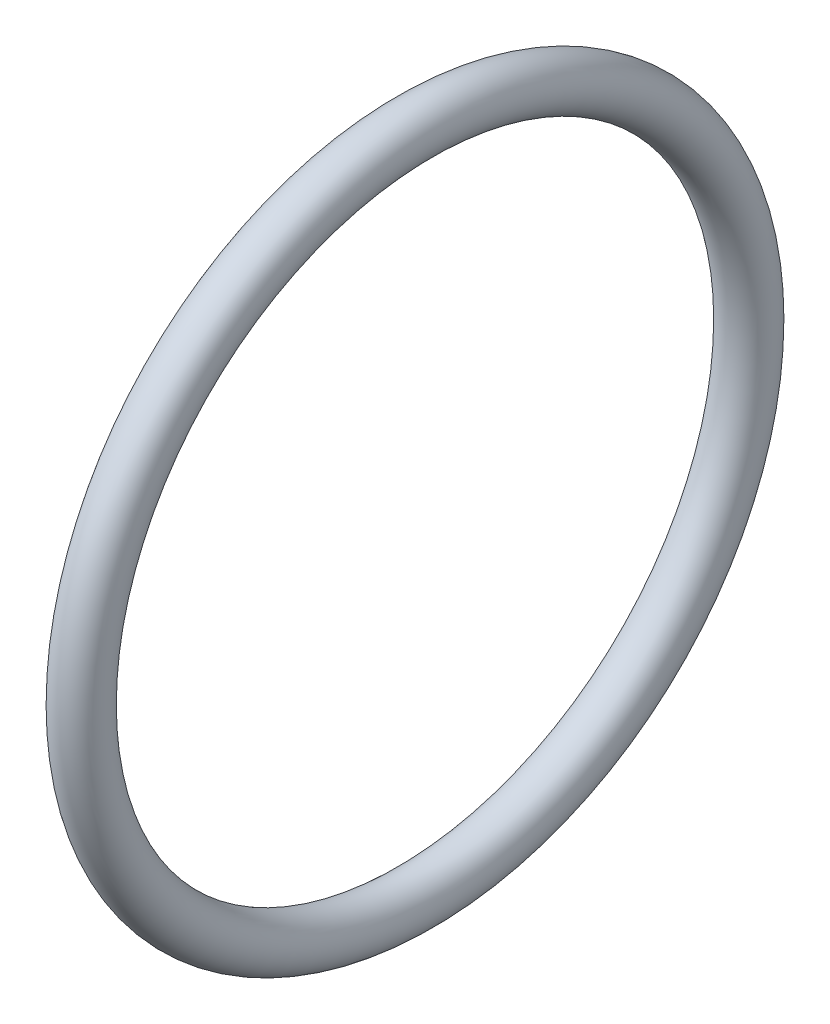
ISO-10303-21;
HEADER;
FILE_DESCRIPTION(('STEP AP214'),'2;1');
FILE_NAME('part.step','',(''),(''),'','','');
FILE_SCHEMA(('AUTOMOTIVE_DESIGN { 1 0 10303 214 1 1 1 1 }'));
ENDSEC;
DATA;
#1=APPLICATION_CONTEXT('core data for automotive mechanical design processes');
#2=APPLICATION_PROTOCOL_DEFINITION('international standard','automotive_design',2000,#1);
#3=PRODUCT_CONTEXT('',#1,'mechanical');
#4=PRODUCT('Part','Part','',(#3));
#5=PRODUCT_RELATED_PRODUCT_CATEGORY('part','',(#4));
#6=PRODUCT_DEFINITION_FORMATION('','',#4);
#7=PRODUCT_DEFINITION_CONTEXT('part definition',#1,'design');
#8=PRODUCT_DEFINITION('design','',#6,#7);
#9=PRODUCT_DEFINITION_SHAPE('','',#8);
#10=(LENGTH_UNIT() NAMED_UNIT(*) SI_UNIT(.MILLI.,.METRE.));
#11=(NAMED_UNIT(*) PLANE_ANGLE_UNIT() SI_UNIT($,.RADIAN.));
#12=(NAMED_UNIT(*) SI_UNIT($,.STERADIAN.) SOLID_ANGLE_UNIT());
#13=UNCERTAINTY_MEASURE_WITH_UNIT(LENGTH_MEASURE(1.E-05),#10,'distance_accuracy_value','');
#14=(GEOMETRIC_REPRESENTATION_CONTEXT(3) GLOBAL_UNCERTAINTY_ASSIGNED_CONTEXT((#13)) GLOBAL_UNIT_ASSIGNED_CONTEXT((#10,
#11,#12)) REPRESENTATION_CONTEXT('',''));
#15=CARTESIAN_POINT('',(0.,0.,0.));
#16=DIRECTION('',(0.,0.,1.));
#17=DIRECTION('',(1.,0.,0.));
#18=AXIS2_PLACEMENT_3D('',#15,#16,#17);
#19=CARTESIAN_POINT('',(0.,0.,0.));
#20=DIRECTION('',(-1.,0.,0.));
#21=DIRECTION('',(0.,0.,1.));
#22=AXIS2_PLACEMENT_3D('',#19,#20,#21);
#23=TOROIDAL_SURFACE('',#22,21.5,1.6);
#24=CARTESIAN_POINT('',(0.,0.,23.1));
#25=VERTEX_POINT('',#24);
#26=VERTEX_LOOP('',#25);
#27=FACE_BOUND('',#26,.T.);
#28=ADVANCED_FACE('F30',(#27),#23,.T.);
#29=CLOSED_SHELL('',(#28));
#30=MANIFOLD_SOLID_BREP('B2',#29);
#31=ADVANCED_BREP_SHAPE_REPRESENTATION('',(#18,#30),#14);
#32=SHAPE_DEFINITION_REPRESENTATION(#9,#31);
ENDSEC;
END-ISO-10303-21;
